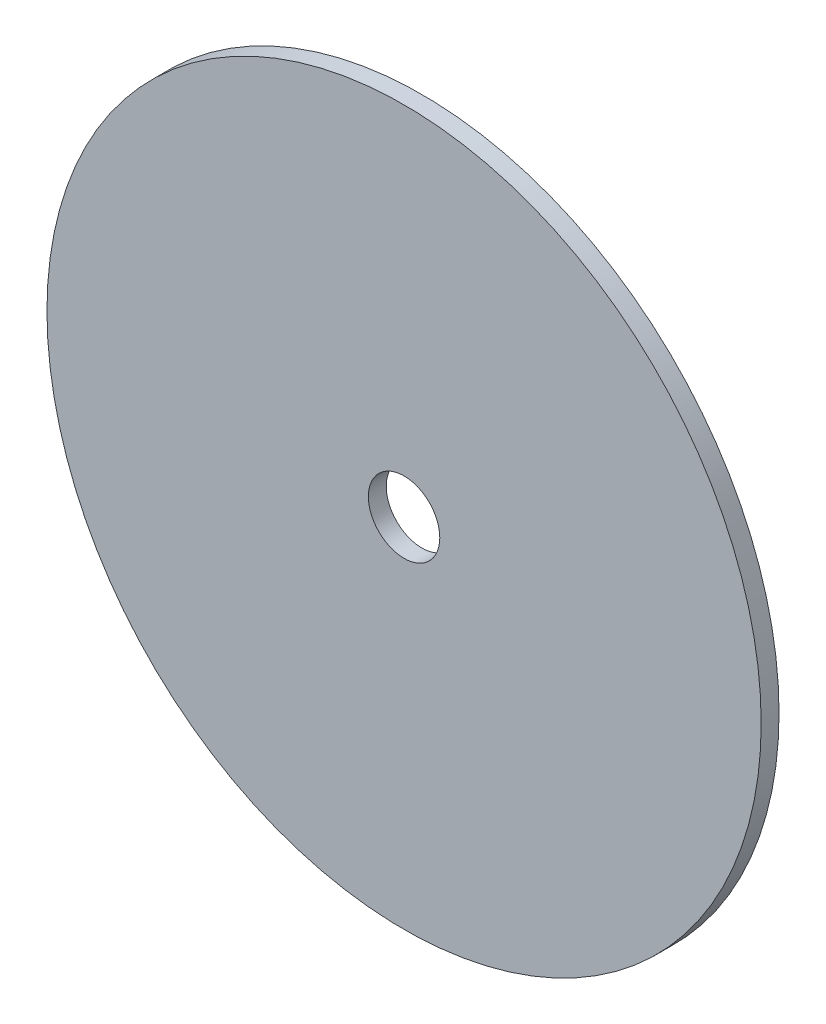
ISO-10303-21;
HEADER;
FILE_DESCRIPTION(('STEP AP214'),'2;1');
FILE_NAME('part.step','',(''),(''),'','','');
FILE_SCHEMA(('AUTOMOTIVE_DESIGN { 1 0 10303 214 1 1 1 1 }'));
ENDSEC;
DATA;
#1=APPLICATION_CONTEXT('core data for automotive mechanical design processes');
#2=APPLICATION_PROTOCOL_DEFINITION('international standard','automotive_design',2000,#1);
#3=PRODUCT_CONTEXT('',#1,'mechanical');
#4=PRODUCT('Part','Part','',(#3));
#5=PRODUCT_RELATED_PRODUCT_CATEGORY('part','',(#4));
#6=PRODUCT_DEFINITION_FORMATION('','',#4);
#7=PRODUCT_DEFINITION_CONTEXT('part definition',#1,'design');
#8=PRODUCT_DEFINITION('design','',#6,#7);
#9=PRODUCT_DEFINITION_SHAPE('','',#8);
#10=(LENGTH_UNIT() NAMED_UNIT(*) SI_UNIT(.MILLI.,.METRE.));
#11=(NAMED_UNIT(*) PLANE_ANGLE_UNIT() SI_UNIT($,.RADIAN.));
#12=(NAMED_UNIT(*) SI_UNIT($,.STERADIAN.) SOLID_ANGLE_UNIT());
#13=UNCERTAINTY_MEASURE_WITH_UNIT(LENGTH_MEASURE(1.E-05),#10,'distance_accuracy_value','');
#14=(GEOMETRIC_REPRESENTATION_CONTEXT(3) GLOBAL_UNCERTAINTY_ASSIGNED_CONTEXT((#13)) GLOBAL_UNIT_ASSIGNED_CONTEXT((#10,
#11,#12)) REPRESENTATION_CONTEXT('',''));
#15=CARTESIAN_POINT('',(0.,0.,0.));
#16=DIRECTION('',(0.,0.,1.));
#17=DIRECTION('',(1.,0.,0.));
#18=AXIS2_PLACEMENT_3D('',#15,#16,#17);
#19=CARTESIAN_POINT('',(0.,0.,1.));
#20=DIRECTION('',(0.,0.,1.));
#21=DIRECTION('',(1.,0.,0.));
#22=AXIS2_PLACEMENT_3D('',#19,#20,#21);
#23=PLANE('',#22);
#24=CARTESIAN_POINT('',(0.,0.,1.));
#25=DIRECTION('',(0.,0.,1.));
#26=DIRECTION('',(1.,0.,0.));
#27=AXIS2_PLACEMENT_3D('',#24,#25,#26);
#28=CIRCLE('',#27,20.);
#29=CARTESIAN_POINT('',(20.,0.,1.));
#30=VERTEX_POINT('',#29);
#31=EDGE_CURVE('E10',#30,#30,#28,.T.);
#32=ORIENTED_EDGE('',*,*,#31,.T.);
#33=EDGE_LOOP('',(#32));
#34=FACE_BOUND('',#33,.T.);
#35=CARTESIAN_POINT('',(0.,0.,1.));
#36=DIRECTION('',(0.,0.,1.));
#37=DIRECTION('',(1.,0.,0.));
#38=AXIS2_PLACEMENT_3D('',#35,#36,#37);
#39=CIRCLE('',#38,2.);
#40=CARTESIAN_POINT('',(2.,0.,1.));
#41=VERTEX_POINT('',#40);
#42=EDGE_CURVE('E42',#41,#41,#39,.T.);
#43=ORIENTED_EDGE('',*,*,#42,.F.);
#44=EDGE_LOOP('',(#43));
#45=FACE_BOUND('',#44,.T.);
#46=ADVANCED_FACE('F31',(#34,#45),#23,.T.);
#47=CARTESIAN_POINT('',(0.,0.,0.));
#48=DIRECTION('',(0.,0.,1.));
#49=DIRECTION('',(1.,0.,0.));
#50=AXIS2_PLACEMENT_3D('',#47,#48,#49);
#51=PLANE('',#50);
#52=CARTESIAN_POINT('',(0.,0.,0.));
#53=DIRECTION('',(0.,0.,1.));
#54=DIRECTION('',(1.,0.,0.));
#55=AXIS2_PLACEMENT_3D('',#52,#53,#54);
#56=CIRCLE('',#55,20.);
#57=CARTESIAN_POINT('',(20.,0.,0.));
#58=VERTEX_POINT('',#57);
#59=EDGE_CURVE('E35',#58,#58,#56,.T.);
#60=ORIENTED_EDGE('',*,*,#59,.F.);
#61=EDGE_LOOP('',(#60));
#62=FACE_BOUND('',#61,.T.);
#63=CARTESIAN_POINT('',(0.,0.,0.));
#64=DIRECTION('',(0.,0.,1.));
#65=DIRECTION('',(1.,0.,0.));
#66=AXIS2_PLACEMENT_3D('',#63,#64,#65);
#67=CIRCLE('',#66,2.);
#68=CARTESIAN_POINT('',(2.,0.,0.));
#69=VERTEX_POINT('',#68);
#70=EDGE_CURVE('E44',#69,#69,#67,.T.);
#71=ORIENTED_EDGE('',*,*,#70,.T.);
#72=EDGE_LOOP('',(#71));
#73=FACE_BOUND('',#72,.T.);
#74=ADVANCED_FACE('F54',(#62,#73),#51,.F.);
#75=CARTESIAN_POINT('',(0.,0.,1.));
#76=DIRECTION('',(0.,0.,-1.));
#77=DIRECTION('',(-1.,0.,0.));
#78=AXIS2_PLACEMENT_3D('',#75,#76,#77);
#79=CYLINDRICAL_SURFACE('',#78,20.);
#80=ORIENTED_EDGE('',*,*,#31,.F.);
#81=EDGE_LOOP('',(#80));
#82=FACE_BOUND('',#81,.T.);
#83=ORIENTED_EDGE('',*,*,#59,.T.);
#84=EDGE_LOOP('',(#83));
#85=FACE_BOUND('',#84,.T.);
#86=ADVANCED_FACE('F33',(#82,#85),#79,.T.);
#87=CARTESIAN_POINT('',(0.,0.,1.));
#88=DIRECTION('',(0.,0.,-1.));
#89=DIRECTION('',(-1.,0.,0.));
#90=AXIS2_PLACEMENT_3D('',#87,#88,#89);
#91=CYLINDRICAL_SURFACE('',#90,2.);
#92=ORIENTED_EDGE('',*,*,#42,.T.);
#93=EDGE_LOOP('',(#92));
#94=FACE_BOUND('',#93,.T.);
#95=ORIENTED_EDGE('',*,*,#70,.F.);
#96=EDGE_LOOP('',(#95));
#97=FACE_BOUND('',#96,.T.);
#98=ADVANCED_FACE('F50',(#94,#97),#91,.F.);
#99=CLOSED_SHELL('',(#46,#74,#86,#98));
#100=MANIFOLD_SOLID_BREP('B2',#99);
#101=ADVANCED_BREP_SHAPE_REPRESENTATION('',(#18,#100),#14);
#102=SHAPE_DEFINITION_REPRESENTATION(#9,#101);
ENDSEC;
END-ISO-10303-21;
